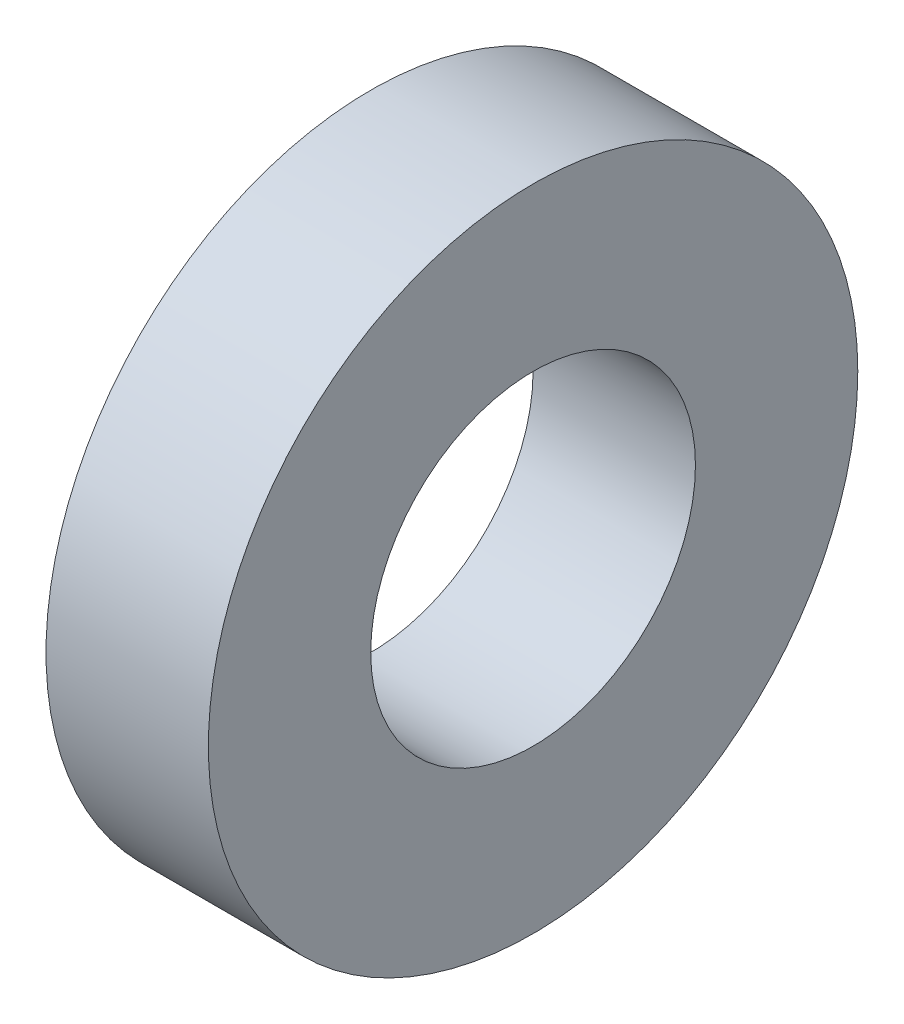
ISO-10303-21;
HEADER;
FILE_DESCRIPTION(('STEP AP214'),'2;1');
FILE_NAME('part.step','',(''),(''),'','','');
FILE_SCHEMA(('AUTOMOTIVE_DESIGN { 1 0 10303 214 1 1 1 1 }'));
ENDSEC;
DATA;
#1=APPLICATION_CONTEXT('core data for automotive mechanical design processes');
#2=APPLICATION_PROTOCOL_DEFINITION('international standard','automotive_design',2000,#1);
#3=PRODUCT_CONTEXT('',#1,'mechanical');
#4=PRODUCT('Part','Part','',(#3));
#5=PRODUCT_RELATED_PRODUCT_CATEGORY('part','',(#4));
#6=PRODUCT_DEFINITION_FORMATION('','',#4);
#7=PRODUCT_DEFINITION_CONTEXT('part definition',#1,'design');
#8=PRODUCT_DEFINITION('design','',#6,#7);
#9=PRODUCT_DEFINITION_SHAPE('','',#8);
#10=(LENGTH_UNIT() NAMED_UNIT(*) SI_UNIT(.MILLI.,.METRE.));
#11=(NAMED_UNIT(*) PLANE_ANGLE_UNIT() SI_UNIT($,.RADIAN.));
#12=(NAMED_UNIT(*) SI_UNIT($,.STERADIAN.) SOLID_ANGLE_UNIT());
#13=UNCERTAINTY_MEASURE_WITH_UNIT(LENGTH_MEASURE(1.E-05),#10,'distance_accuracy_value','');
#14=(GEOMETRIC_REPRESENTATION_CONTEXT(3) GLOBAL_UNCERTAINTY_ASSIGNED_CONTEXT((#13)) GLOBAL_UNIT_ASSIGNED_CONTEXT((#10,
#11,#12)) REPRESENTATION_CONTEXT('',''));
#15=CARTESIAN_POINT('',(0.,0.,0.));
#16=DIRECTION('',(0.,0.,1.));
#17=DIRECTION('',(1.,0.,0.));
#18=AXIS2_PLACEMENT_3D('',#15,#16,#17);
#19=CARTESIAN_POINT('',(10.,0.,0.));
#20=DIRECTION('',(1.,0.,0.));
#21=DIRECTION('',(0.,0.,-1.));
#22=AXIS2_PLACEMENT_3D('',#19,#20,#21);
#23=PLANE('',#22);
#24=CARTESIAN_POINT('',(10.,0.,0.));
#25=DIRECTION('',(1.,0.,0.));
#26=DIRECTION('',(0.,0.,-1.));
#27=AXIS2_PLACEMENT_3D('',#24,#25,#26);
#28=CIRCLE('',#27,20.);
#29=CARTESIAN_POINT('',(10.,0.,-20.));
#30=VERTEX_POINT('',#29);
#31=EDGE_CURVE('E10',#30,#30,#28,.T.);
#32=ORIENTED_EDGE('',*,*,#31,.T.);
#33=EDGE_LOOP('',(#32));
#34=FACE_BOUND('',#33,.T.);
#35=CARTESIAN_POINT('',(10.,0.,0.));
#36=DIRECTION('',(1.,0.,0.));
#37=DIRECTION('',(0.,0.,-1.));
#38=AXIS2_PLACEMENT_3D('',#35,#36,#37);
#39=CIRCLE('',#38,10.);
#40=CARTESIAN_POINT('',(10.,0.,-10.));
#41=VERTEX_POINT('',#40);
#42=EDGE_CURVE('E42',#41,#41,#39,.T.);
#43=ORIENTED_EDGE('',*,*,#42,.F.);
#44=EDGE_LOOP('',(#43));
#45=FACE_BOUND('',#44,.T.);
#46=ADVANCED_FACE('F31',(#34,#45),#23,.T.);
#47=CARTESIAN_POINT('',(0.,0.,0.));
#48=DIRECTION('',(1.,0.,0.));
#49=DIRECTION('',(0.,0.,-1.));
#50=AXIS2_PLACEMENT_3D('',#47,#48,#49);
#51=PLANE('',#50);
#52=CARTESIAN_POINT('',(0.,0.,0.));
#53=DIRECTION('',(1.,0.,0.));
#54=DIRECTION('',(0.,0.,-1.));
#55=AXIS2_PLACEMENT_3D('',#52,#53,#54);
#56=CIRCLE('',#55,20.);
#57=CARTESIAN_POINT('',(0.,0.,-20.));
#58=VERTEX_POINT('',#57);
#59=EDGE_CURVE('E35',#58,#58,#56,.T.);
#60=ORIENTED_EDGE('',*,*,#59,.F.);
#61=EDGE_LOOP('',(#60));
#62=FACE_BOUND('',#61,.T.);
#63=CARTESIAN_POINT('',(0.,0.,0.));
#64=DIRECTION('',(1.,0.,0.));
#65=DIRECTION('',(0.,0.,-1.));
#66=AXIS2_PLACEMENT_3D('',#63,#64,#65);
#67=CIRCLE('',#66,10.);
#68=CARTESIAN_POINT('',(0.,0.,-10.));
#69=VERTEX_POINT('',#68);
#70=EDGE_CURVE('E44',#69,#69,#67,.T.);
#71=ORIENTED_EDGE('',*,*,#70,.T.);
#72=EDGE_LOOP('',(#71));
#73=FACE_BOUND('',#72,.T.);
#74=ADVANCED_FACE('F54',(#62,#73),#51,.F.);
#75=CARTESIAN_POINT('',(10.,0.,0.));
#76=DIRECTION('',(-1.,0.,0.));
#77=DIRECTION('',(0.,0.,1.));
#78=AXIS2_PLACEMENT_3D('',#75,#76,#77);
#79=CYLINDRICAL_SURFACE('',#78,20.);
#80=ORIENTED_EDGE('',*,*,#31,.F.);
#81=EDGE_LOOP('',(#80));
#82=FACE_BOUND('',#81,.T.);
#83=ORIENTED_EDGE('',*,*,#59,.T.);
#84=EDGE_LOOP('',(#83));
#85=FACE_BOUND('',#84,.T.);
#86=ADVANCED_FACE('F33',(#82,#85),#79,.T.);
#87=CARTESIAN_POINT('',(10.,0.,0.));
#88=DIRECTION('',(-1.,0.,0.));
#89=DIRECTION('',(0.,0.,1.));
#90=AXIS2_PLACEMENT_3D('',#87,#88,#89);
#91=CYLINDRICAL_SURFACE('',#90,10.);
#92=ORIENTED_EDGE('',*,*,#42,.T.);
#93=EDGE_LOOP('',(#92));
#94=FACE_BOUND('',#93,.T.);
#95=ORIENTED_EDGE('',*,*,#70,.F.);
#96=EDGE_LOOP('',(#95));
#97=FACE_BOUND('',#96,.T.);
#98=ADVANCED_FACE('F50',(#94,#97),#91,.F.);
#99=CLOSED_SHELL('',(#46,#74,#86,#98));
#100=MANIFOLD_SOLID_BREP('B2',#99);
#101=ADVANCED_BREP_SHAPE_REPRESENTATION('',(#18,#100),#14);
#102=SHAPE_DEFINITION_REPRESENTATION(#9,#101);
ENDSEC;
END-ISO-10303-21;
